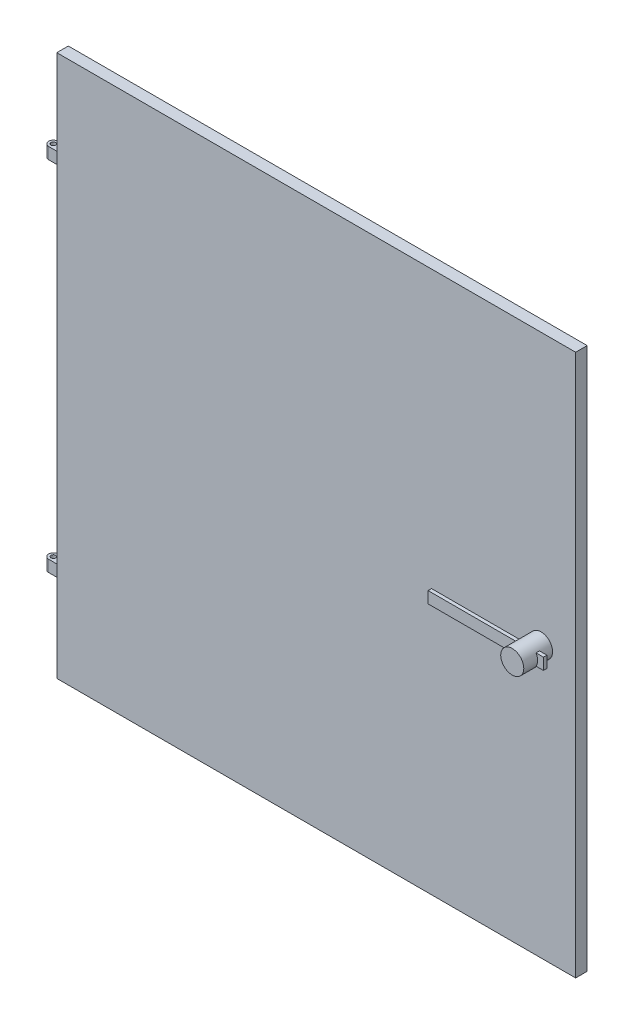
ISO-10303-21;
HEADER;
FILE_DESCRIPTION(('STEP AP214'),'2;1');
FILE_NAME('part.step','',(''),(''),'','','');
FILE_SCHEMA(('AUTOMOTIVE_DESIGN { 1 0 10303 214 1 1 1 1 }'));
ENDSEC;
DATA;
#1=APPLICATION_CONTEXT('core data for automotive mechanical design processes');
#2=APPLICATION_PROTOCOL_DEFINITION('international standard','automotive_design',2000,#1);
#3=PRODUCT_CONTEXT('',#1,'mechanical');
#4=PRODUCT('Part','Part','',(#3));
#5=PRODUCT_RELATED_PRODUCT_CATEGORY('part','',(#4));
#6=PRODUCT_DEFINITION_FORMATION('','',#4);
#7=PRODUCT_DEFINITION_CONTEXT('part definition',#1,'design');
#8=PRODUCT_DEFINITION('design','',#6,#7);
#9=PRODUCT_DEFINITION_SHAPE('','',#8);
#10=(LENGTH_UNIT() NAMED_UNIT(*) SI_UNIT(.MILLI.,.METRE.));
#11=(NAMED_UNIT(*) PLANE_ANGLE_UNIT() SI_UNIT($,.RADIAN.));
#12=(NAMED_UNIT(*) SI_UNIT($,.STERADIAN.) SOLID_ANGLE_UNIT());
#13=UNCERTAINTY_MEASURE_WITH_UNIT(LENGTH_MEASURE(1.E-05),#10,'distance_accuracy_value','');
#14=(GEOMETRIC_REPRESENTATION_CONTEXT(3) GLOBAL_UNCERTAINTY_ASSIGNED_CONTEXT((#13)) GLOBAL_UNIT_ASSIGNED_CONTEXT((#10,
#11,#12)) REPRESENTATION_CONTEXT('',''));
#15=CARTESIAN_POINT('',(0.,0.,0.));
#16=DIRECTION('',(0.,0.,1.));
#17=DIRECTION('',(1.,0.,0.));
#18=AXIS2_PLACEMENT_3D('',#15,#16,#17);
#19=CARTESIAN_POINT('',(420.,235.,35.));
#20=DIRECTION('',(0.,0.,-1.));
#21=DIRECTION('',(-1.,0.,0.));
#22=AXIS2_PLACEMENT_3D('',#19,#20,#21);
#23=CYLINDRICAL_SURFACE('',#22,9.99999999999998);
#24=CARTESIAN_POINT('',(420.,235.,23.));
#25=DIRECTION('',(0.,0.,-1.));
#26=DIRECTION('',(-1.,0.,0.));
#27=AXIS2_PLACEMENT_3D('',#24,#25,#26);
#28=CIRCLE('',#27,9.99999999999998);
#29=CARTESIAN_POINT('',(411.339745962156,230.,23.));
#30=VERTEX_POINT('',#29);
#31=CARTESIAN_POINT('',(411.339745962156,240.,23.));
#32=VERTEX_POINT('',#31);
#33=EDGE_CURVE('E49',#30,#32,#28,.T.);
#34=ORIENTED_EDGE('',*,*,#33,.F.);
#35=DIRECTION('',(0.,0.,-1.));
#36=VECTOR('',#35,1.);
#37=CARTESIAN_POINT('',(411.339745962156,230.,35.));
#38=LINE('',#37,#36);
#39=CARTESIAN_POINT('',(411.339745962156,230.,20.));
#40=VERTEX_POINT('',#39);
#41=EDGE_CURVE('E209',#40,#30,#38,.F.);
#42=ORIENTED_EDGE('',*,*,#41,.F.);
#43=CARTESIAN_POINT('',(420.,235.,20.));
#44=DIRECTION('',(0.,0.,-1.));
#45=DIRECTION('',(-1.,0.,0.));
#46=AXIS2_PLACEMENT_3D('',#43,#44,#45);
#47=CIRCLE('',#46,9.99999999999998);
#48=CARTESIAN_POINT('',(411.339745962156,240.,20.));
#49=VERTEX_POINT('',#48);
#50=EDGE_CURVE('E379',#40,#49,#47,.T.);
#51=ORIENTED_EDGE('',*,*,#50,.T.);
#52=DIRECTION('',(0.,0.,-1.));
#53=VECTOR('',#52,1.);
#54=CARTESIAN_POINT('',(411.339745962156,240.,35.));
#55=LINE('',#54,#53);
#56=EDGE_CURVE('E382',#32,#49,#55,.T.);
#57=ORIENTED_EDGE('',*,*,#56,.F.);
#58=EDGE_LOOP('',(#34,#42,#51,#57));
#59=FACE_BOUND('',#58,.T.);
#60=CARTESIAN_POINT('',(420.,235.,35.));
#61=DIRECTION('',(0.,0.,1.));
#62=DIRECTION('',(1.,0.,0.));
#63=AXIS2_PLACEMENT_3D('',#60,#61,#62);
#64=CIRCLE('',#63,9.99999999999998);
#65=CARTESIAN_POINT('',(430.,235.,35.));
#66=VERTEX_POINT('',#65);
#67=EDGE_CURVE('E227',#66,#66,#64,.T.);
#68=ORIENTED_EDGE('',*,*,#67,.F.);
#69=EDGE_LOOP('',(#68));
#70=FACE_BOUND('',#69,.T.);
#71=CARTESIAN_POINT('',(420.,235.,10.));
#72=DIRECTION('',(0.,0.,-1.));
#73=DIRECTION('',(-1.,0.,0.));
#74=AXIS2_PLACEMENT_3D('',#71,#72,#73);
#75=CIRCLE('',#74,9.99999999999998);
#76=CARTESIAN_POINT('',(410.,235.,10.));
#77=VERTEX_POINT('',#76);
#78=EDGE_CURVE('E376',#77,#77,#75,.F.);
#79=ORIENTED_EDGE('',*,*,#78,.T.);
#80=EDGE_LOOP('',(#79));
#81=FACE_BOUND('',#80,.T.);
#82=CARTESIAN_POINT('',(428.660254037844,240.,23.));
#83=VERTEX_POINT('',#82);
#84=CARTESIAN_POINT('',(428.660254037844,230.,23.));
#85=VERTEX_POINT('',#84);
#86=EDGE_CURVE('E11',#83,#85,#28,.T.);
#87=ORIENTED_EDGE('',*,*,#86,.F.);
#88=DIRECTION('',(0.,0.,-1.));
#89=VECTOR('',#88,1.);
#90=CARTESIAN_POINT('',(428.660254037844,240.,35.));
#91=LINE('',#90,#89);
#92=CARTESIAN_POINT('',(428.660254037844,240.,20.));
#93=VERTEX_POINT('',#92);
#94=EDGE_CURVE('E385',#93,#83,#91,.F.);
#95=ORIENTED_EDGE('',*,*,#94,.F.);
#96=CARTESIAN_POINT('',(428.660254037844,230.,20.));
#97=VERTEX_POINT('',#96);
#98=EDGE_CURVE('E383',#93,#97,#47,.T.);
#99=ORIENTED_EDGE('',*,*,#98,.T.);
#100=DIRECTION('',(0.,0.,-1.));
#101=VECTOR('',#100,1.);
#102=CARTESIAN_POINT('',(428.660254037844,230.,35.));
#103=LINE('',#102,#101);
#104=EDGE_CURVE('E43',#85,#97,#103,.T.);
#105=ORIENTED_EDGE('',*,*,#104,.F.);
#106=EDGE_LOOP('',(#87,#95,#99,#105));
#107=FACE_BOUND('',#106,.T.);
#108=ADVANCED_FACE('F39',(#59,#70,#81,#107),#23,.T.);
#109=CARTESIAN_POINT('',(0.,0.,10.));
#110=DIRECTION('',(1.,0.,0.));
#111=DIRECTION('',(0.,0.,-1.));
#112=AXIS2_PLACEMENT_3D('',#109,#110,#111);
#113=PLANE('',#112);
#114=DIRECTION('',(0.,0.,-1.));
#115=VECTOR('',#114,1.);
#116=CARTESIAN_POINT('',(0.,385.,9.));
#117=LINE('',#116,#115);
#118=CARTESIAN_POINT('',(0.,385.,9.));
#119=VERTEX_POINT('',#118);
#120=CARTESIAN_POINT('',(0.,385.,0.999999999999997));
#121=VERTEX_POINT('',#120);
#122=EDGE_CURVE('E291',#119,#121,#117,.T.);
#123=ORIENTED_EDGE('',*,*,#122,.T.);
#124=DIRECTION('',(0.,1.,0.));
#125=VECTOR('',#124,1.);
#126=CARTESIAN_POINT('',(0.,385.,0.999999999999997));
#127=LINE('',#126,#125);
#128=CARTESIAN_POINT('',(0.,395.,0.999999999999997));
#129=VERTEX_POINT('',#128);
#130=EDGE_CURVE('E309',#121,#129,#127,.T.);
#131=ORIENTED_EDGE('',*,*,#130,.T.);
#132=DIRECTION('',(0.,0.,-1.));
#133=VECTOR('',#132,1.);
#134=CARTESIAN_POINT('',(0.,395.,9.));
#135=LINE('',#134,#133);
#136=CARTESIAN_POINT('',(0.,395.,9.00000000000001));
#137=VERTEX_POINT('',#136);
#138=EDGE_CURVE('E302',#137,#129,#135,.T.);
#139=ORIENTED_EDGE('',*,*,#138,.F.);
#140=DIRECTION('',(0.,1.,0.));
#141=VECTOR('',#140,1.);
#142=CARTESIAN_POINT('',(0.,385.,9.));
#143=LINE('',#142,#141);
#144=EDGE_CURVE('E312',#119,#137,#143,.T.);
#145=ORIENTED_EDGE('',*,*,#144,.F.);
#146=EDGE_LOOP('',(#123,#131,#139,#145));
#147=FACE_BOUND('',#146,.T.);
#148=DIRECTION('',(0.,-1.,0.));
#149=VECTOR('',#148,1.);
#150=CARTESIAN_POINT('',(0.,0.,0.));
#151=LINE('',#150,#149);
#152=CARTESIAN_POINT('',(0.,470.,0.));
#153=VERTEX_POINT('',#152);
#154=CARTESIAN_POINT('',(0.,0.,0.));
#155=VERTEX_POINT('',#154);
#156=EDGE_CURVE('E319',#153,#155,#151,.T.);
#157=ORIENTED_EDGE('',*,*,#156,.T.);
#158=DIRECTION('',(0.,0.,-1.));
#159=VECTOR('',#158,1.);
#160=CARTESIAN_POINT('',(0.,0.,10.));
#161=LINE('',#160,#159);
#162=CARTESIAN_POINT('',(0.,0.,10.));
#163=VERTEX_POINT('',#162);
#164=EDGE_CURVE('E373',#163,#155,#161,.T.);
#165=ORIENTED_EDGE('',*,*,#164,.F.);
#166=DIRECTION('',(0.,-1.,0.));
#167=VECTOR('',#166,1.);
#168=CARTESIAN_POINT('',(0.,0.,10.));
#169=LINE('',#168,#167);
#170=CARTESIAN_POINT('',(0.,470.,10.));
#171=VERTEX_POINT('',#170);
#172=EDGE_CURVE('E347',#171,#163,#169,.T.);
#173=ORIENTED_EDGE('',*,*,#172,.F.);
#174=DIRECTION('',(0.,0.,-1.));
#175=VECTOR('',#174,1.);
#176=CARTESIAN_POINT('',(0.,470.,10.));
#177=LINE('',#176,#175);
#178=EDGE_CURVE('E357',#171,#153,#177,.T.);
#179=ORIENTED_EDGE('',*,*,#178,.T.);
#180=EDGE_LOOP('',(#157,#165,#173,#179));
#181=FACE_BOUND('',#180,.T.);
#182=DIRECTION('',(0.,-1.,0.));
#183=VECTOR('',#182,1.);
#184=CARTESIAN_POINT('',(0.,84.9999999999999,9.));
#185=LINE('',#184,#183);
#186=CARTESIAN_POINT('',(0.,84.9999999999999,9.00000000000001));
#187=VERTEX_POINT('',#186);
#188=CARTESIAN_POINT('',(0.,74.9999999999999,9.00000000000001));
#189=VERTEX_POINT('',#188);
#190=EDGE_CURVE('E270',#187,#189,#185,.T.);
#191=ORIENTED_EDGE('',*,*,#190,.T.);
#192=DIRECTION('',(0.,0.,-1.));
#193=VECTOR('',#192,1.);
#194=CARTESIAN_POINT('',(0.,74.9999999999999,9.));
#195=LINE('',#194,#193);
#196=CARTESIAN_POINT('',(0.,74.9999999999999,0.999999999999997));
#197=VERTEX_POINT('',#196);
#198=EDGE_CURVE('E262',#189,#197,#195,.T.);
#199=ORIENTED_EDGE('',*,*,#198,.T.);
#200=DIRECTION('',(0.,-1.,0.));
#201=VECTOR('',#200,1.);
#202=CARTESIAN_POINT('',(0.,84.9999999999999,0.999999999999997));
#203=LINE('',#202,#201);
#204=CARTESIAN_POINT('',(0.,84.9999999999999,0.999999999999997));
#205=VERTEX_POINT('',#204);
#206=EDGE_CURVE('E272',#205,#197,#203,.T.);
#207=ORIENTED_EDGE('',*,*,#206,.F.);
#208=DIRECTION('',(0.,0.,-1.));
#209=VECTOR('',#208,1.);
#210=CARTESIAN_POINT('',(0.,84.9999999999999,9.));
#211=LINE('',#210,#209);
#212=EDGE_CURVE('E251',#187,#205,#211,.T.);
#213=ORIENTED_EDGE('',*,*,#212,.F.);
#214=EDGE_LOOP('',(#191,#199,#207,#213));
#215=FACE_BOUND('',#214,.T.);
#216=ADVANCED_FACE('F41',(#147,#181,#215),#113,.F.);
#217=CARTESIAN_POINT('',(0.,470.,0.));
#218=DIRECTION('',(0.,0.,-1.));
#219=DIRECTION('',(-1.,0.,0.));
#220=AXIS2_PLACEMENT_3D('',#217,#218,#219);
#221=PLANE('',#220);
#222=ORIENTED_EDGE('',*,*,#156,.F.);
#223=DIRECTION('',(-1.,0.,0.));
#224=VECTOR('',#223,1.);
#225=CARTESIAN_POINT('',(0.,470.,0.));
#226=LINE('',#225,#224);
#227=CARTESIAN_POINT('',(450.,470.,0.));
#228=VERTEX_POINT('',#227);
#229=EDGE_CURVE('E351',#228,#153,#226,.T.);
#230=ORIENTED_EDGE('',*,*,#229,.F.);
#231=DIRECTION('',(0.,1.,0.));
#232=VECTOR('',#231,1.);
#233=CARTESIAN_POINT('',(450.,0.,0.));
#234=LINE('',#233,#232);
#235=CARTESIAN_POINT('',(450.,0.,0.));
#236=VERTEX_POINT('',#235);
#237=EDGE_CURVE('E362',#236,#228,#234,.T.);
#238=ORIENTED_EDGE('',*,*,#237,.F.);
#239=DIRECTION('',(1.,0.,0.));
#240=VECTOR('',#239,1.);
#241=CARTESIAN_POINT('',(0.,0.,0.));
#242=LINE('',#241,#240);
#243=EDGE_CURVE('E360',#155,#236,#242,.T.);
#244=ORIENTED_EDGE('',*,*,#243,.F.);
#245=EDGE_LOOP('',(#222,#230,#238,#244));
#246=FACE_BOUND('',#245,.T.);
#247=DIRECTION('',(-1.,0.,0.));
#248=VECTOR('',#247,1.);
#249=CARTESIAN_POINT('',(0.,468.,0.));
#250=LINE('',#249,#248);
#251=CARTESIAN_POINT('',(448.,468.,0.));
#252=VERTEX_POINT('',#251);
#253=CARTESIAN_POINT('',(2.,468.,0.));
#254=VERTEX_POINT('',#253);
#255=EDGE_CURVE('E325',#252,#254,#250,.T.);
#256=ORIENTED_EDGE('',*,*,#255,.T.);
#257=DIRECTION('',(0.,-1.,0.));
#258=VECTOR('',#257,1.);
#259=CARTESIAN_POINT('',(2.,470.,0.));
#260=LINE('',#259,#258);
#261=CARTESIAN_POINT('',(2.,2.,0.));
#262=VERTEX_POINT('',#261);
#263=EDGE_CURVE('E308',#254,#262,#260,.T.);
#264=ORIENTED_EDGE('',*,*,#263,.T.);
#265=DIRECTION('',(1.,0.,0.));
#266=VECTOR('',#265,1.);
#267=CARTESIAN_POINT('',(0.,2.,0.));
#268=LINE('',#267,#266);
#269=CARTESIAN_POINT('',(448.,2.,0.));
#270=VERTEX_POINT('',#269);
#271=EDGE_CURVE('E339',#262,#270,#268,.T.);
#272=ORIENTED_EDGE('',*,*,#271,.T.);
#273=DIRECTION('',(0.,1.,0.));
#274=VECTOR('',#273,1.);
#275=CARTESIAN_POINT('',(448.,470.,0.));
#276=LINE('',#275,#274);
#277=EDGE_CURVE('E342',#270,#252,#276,.T.);
#278=ORIENTED_EDGE('',*,*,#277,.T.);
#279=EDGE_LOOP('',(#256,#264,#272,#278));
#280=FACE_BOUND('',#279,.T.);
#281=ADVANCED_FACE('F437',(#246,#280),#221,.T.);
#282=CARTESIAN_POINT('',(0.,0.,10.));
#283=DIRECTION('',(0.,1.,0.));
#284=DIRECTION('',(0.,0.,1.));
#285=AXIS2_PLACEMENT_3D('',#282,#283,#284);
#286=PLANE('',#285);
#287=ORIENTED_EDGE('',*,*,#243,.T.);
#288=DIRECTION('',(0.,0.,-1.));
#289=VECTOR('',#288,1.);
#290=CARTESIAN_POINT('',(450.,0.,10.));
#291=LINE('',#290,#289);
#292=CARTESIAN_POINT('',(450.,0.,10.));
#293=VERTEX_POINT('',#292);
#294=EDGE_CURVE('E370',#293,#236,#291,.T.);
#295=ORIENTED_EDGE('',*,*,#294,.F.);
#296=DIRECTION('',(1.,0.,0.));
#297=VECTOR('',#296,1.);
#298=CARTESIAN_POINT('',(0.,0.,10.));
#299=LINE('',#298,#297);
#300=EDGE_CURVE('E350',#163,#293,#299,.T.);
#301=ORIENTED_EDGE('',*,*,#300,.F.);
#302=ORIENTED_EDGE('',*,*,#164,.T.);
#303=EDGE_LOOP('',(#287,#295,#301,#302));
#304=FACE_BOUND('',#303,.T.);
#305=ADVANCED_FACE('F519',(#304),#286,.F.);
#306=CARTESIAN_POINT('',(450.,0.,10.));
#307=DIRECTION('',(-1.,0.,0.));
#308=DIRECTION('',(0.,0.,1.));
#309=AXIS2_PLACEMENT_3D('',#306,#307,#308);
#310=PLANE('',#309);
#311=ORIENTED_EDGE('',*,*,#237,.T.);
#312=DIRECTION('',(0.,0.,-1.));
#313=VECTOR('',#312,1.);
#314=CARTESIAN_POINT('',(450.,470.,10.));
#315=LINE('',#314,#313);
#316=CARTESIAN_POINT('',(450.,470.,10.));
#317=VERTEX_POINT('',#316);
#318=EDGE_CURVE('E367',#317,#228,#315,.T.);
#319=ORIENTED_EDGE('',*,*,#318,.F.);
#320=DIRECTION('',(0.,1.,0.));
#321=VECTOR('',#320,1.);
#322=CARTESIAN_POINT('',(450.,0.,10.));
#323=LINE('',#322,#321);
#324=EDGE_CURVE('E353',#293,#317,#323,.T.);
#325=ORIENTED_EDGE('',*,*,#324,.F.);
#326=ORIENTED_EDGE('',*,*,#294,.T.);
#327=EDGE_LOOP('',(#311,#319,#325,#326));
#328=FACE_BOUND('',#327,.T.);
#329=ADVANCED_FACE('F523',(#328),#310,.F.);
#330=CARTESIAN_POINT('',(0.,470.,10.));
#331=DIRECTION('',(0.,-1.,0.));
#332=DIRECTION('',(0.,0.,-1.));
#333=AXIS2_PLACEMENT_3D('',#330,#331,#332);
#334=PLANE('',#333);
#335=ORIENTED_EDGE('',*,*,#229,.T.);
#336=ORIENTED_EDGE('',*,*,#178,.F.);
#337=DIRECTION('',(-1.,0.,0.));
#338=VECTOR('',#337,1.);
#339=CARTESIAN_POINT('',(0.,470.,10.));
#340=LINE('',#339,#338);
#341=EDGE_CURVE('E355',#317,#171,#340,.T.);
#342=ORIENTED_EDGE('',*,*,#341,.F.);
#343=ORIENTED_EDGE('',*,*,#318,.T.);
#344=EDGE_LOOP('',(#335,#336,#342,#343));
#345=FACE_BOUND('',#344,.T.);
#346=ADVANCED_FACE('F515',(#345),#334,.F.);
#347=CARTESIAN_POINT('',(0.,470.,10.));
#348=DIRECTION('',(0.,0.,-1.));
#349=DIRECTION('',(-1.,0.,0.));
#350=AXIS2_PLACEMENT_3D('',#347,#348,#349);
#351=PLANE('',#350);
#352=ORIENTED_EDGE('',*,*,#78,.F.);
#353=EDGE_LOOP('',(#352));
#354=FACE_BOUND('',#353,.T.);
#355=ORIENTED_EDGE('',*,*,#172,.T.);
#356=ORIENTED_EDGE('',*,*,#300,.T.);
#357=ORIENTED_EDGE('',*,*,#324,.T.);
#358=ORIENTED_EDGE('',*,*,#341,.T.);
#359=EDGE_LOOP('',(#355,#356,#357,#358));
#360=FACE_BOUND('',#359,.T.);
#361=ADVANCED_FACE('F497',(#354,#360),#351,.F.);
#362=CARTESIAN_POINT('',(2.,0.,10.));
#363=DIRECTION('',(1.,0.,0.));
#364=DIRECTION('',(0.,0.,-1.));
#365=AXIS2_PLACEMENT_3D('',#362,#363,#364);
#366=PLANE('',#365);
#367=ORIENTED_EDGE('',*,*,#263,.F.);
#368=DIRECTION('',(0.,0.,-1.));
#369=VECTOR('',#368,1.);
#370=CARTESIAN_POINT('',(2.,468.,10.));
#371=LINE('',#370,#369);
#372=CARTESIAN_POINT('',(2.,468.,8.));
#373=VERTEX_POINT('',#372);
#374=EDGE_CURVE('E326',#373,#254,#371,.T.);
#375=ORIENTED_EDGE('',*,*,#374,.F.);
#376=DIRECTION('',(0.,-1.,0.));
#377=VECTOR('',#376,1.);
#378=CARTESIAN_POINT('',(2.,470.,8.));
#379=LINE('',#378,#377);
#380=CARTESIAN_POINT('',(2.,2.,8.));
#381=VERTEX_POINT('',#380);
#382=EDGE_CURVE('E321',#373,#381,#379,.T.);
#383=ORIENTED_EDGE('',*,*,#382,.T.);
#384=DIRECTION('',(0.,0.,-1.));
#385=VECTOR('',#384,1.);
#386=CARTESIAN_POINT('',(2.,2.,10.));
#387=LINE('',#386,#385);
#388=EDGE_CURVE('E316',#381,#262,#387,.T.);
#389=ORIENTED_EDGE('',*,*,#388,.T.);
#390=EDGE_LOOP('',(#367,#375,#383,#389));
#391=FACE_BOUND('',#390,.T.);
#392=ADVANCED_FACE('F493',(#391),#366,.T.);
#393=CARTESIAN_POINT('',(0.,2.,10.));
#394=DIRECTION('',(0.,1.,0.));
#395=DIRECTION('',(0.,0.,1.));
#396=AXIS2_PLACEMENT_3D('',#393,#394,#395);
#397=PLANE('',#396);
#398=ORIENTED_EDGE('',*,*,#271,.F.);
#399=ORIENTED_EDGE('',*,*,#388,.F.);
#400=DIRECTION('',(1.,0.,0.));
#401=VECTOR('',#400,1.);
#402=CARTESIAN_POINT('',(0.,2.,8.));
#403=LINE('',#402,#401);
#404=CARTESIAN_POINT('',(448.,2.,8.));
#405=VERTEX_POINT('',#404);
#406=EDGE_CURVE('E324',#381,#405,#403,.T.);
#407=ORIENTED_EDGE('',*,*,#406,.T.);
#408=DIRECTION('',(0.,0.,-1.));
#409=VECTOR('',#408,1.);
#410=CARTESIAN_POINT('',(448.,2.,10.));
#411=LINE('',#410,#409);
#412=EDGE_CURVE('E320',#405,#270,#411,.T.);
#413=ORIENTED_EDGE('',*,*,#412,.T.);
#414=EDGE_LOOP('',(#398,#399,#407,#413));
#415=FACE_BOUND('',#414,.T.);
#416=ADVANCED_FACE('F496',(#415),#397,.T.);
#417=CARTESIAN_POINT('',(448.,0.,10.));
#418=DIRECTION('',(-1.,0.,0.));
#419=DIRECTION('',(0.,0.,1.));
#420=AXIS2_PLACEMENT_3D('',#417,#418,#419);
#421=PLANE('',#420);
#422=ORIENTED_EDGE('',*,*,#277,.F.);
#423=ORIENTED_EDGE('',*,*,#412,.F.);
#424=DIRECTION('',(0.,1.,0.));
#425=VECTOR('',#424,1.);
#426=CARTESIAN_POINT('',(448.,470.,8.));
#427=LINE('',#426,#425);
#428=CARTESIAN_POINT('',(448.,468.,8.));
#429=VERTEX_POINT('',#428);
#430=EDGE_CURVE('E333',#405,#429,#427,.T.);
#431=ORIENTED_EDGE('',*,*,#430,.T.);
#432=DIRECTION('',(0.,0.,-1.));
#433=VECTOR('',#432,1.);
#434=CARTESIAN_POINT('',(448.,468.,10.));
#435=LINE('',#434,#433);
#436=EDGE_CURVE('E328',#429,#252,#435,.T.);
#437=ORIENTED_EDGE('',*,*,#436,.T.);
#438=EDGE_LOOP('',(#422,#423,#431,#437));
#439=FACE_BOUND('',#438,.T.);
#440=ADVANCED_FACE('F501',(#439),#421,.T.);
#441=CARTESIAN_POINT('',(0.,468.,10.));
#442=DIRECTION('',(0.,-1.,0.));
#443=DIRECTION('',(0.,0.,-1.));
#444=AXIS2_PLACEMENT_3D('',#441,#442,#443);
#445=PLANE('',#444);
#446=ORIENTED_EDGE('',*,*,#255,.F.);
#447=ORIENTED_EDGE('',*,*,#436,.F.);
#448=DIRECTION('',(-1.,0.,0.));
#449=VECTOR('',#448,1.);
#450=CARTESIAN_POINT('',(0.,468.,8.));
#451=LINE('',#450,#449);
#452=EDGE_CURVE('E329',#429,#373,#451,.T.);
#453=ORIENTED_EDGE('',*,*,#452,.T.);
#454=ORIENTED_EDGE('',*,*,#374,.T.);
#455=EDGE_LOOP('',(#446,#447,#453,#454));
#456=FACE_BOUND('',#455,.T.);
#457=ADVANCED_FACE('F505',(#456),#445,.T.);
#458=CARTESIAN_POINT('',(0.,470.,8.));
#459=DIRECTION('',(0.,0.,-1.));
#460=DIRECTION('',(-1.,0.,0.));
#461=AXIS2_PLACEMENT_3D('',#458,#459,#460);
#462=PLANE('',#461);
#463=ORIENTED_EDGE('',*,*,#382,.F.);
#464=ORIENTED_EDGE('',*,*,#452,.F.);
#465=ORIENTED_EDGE('',*,*,#430,.F.);
#466=ORIENTED_EDGE('',*,*,#406,.F.);
#467=EDGE_LOOP('',(#463,#464,#465,#466));
#468=FACE_BOUND('',#467,.T.);
#469=ADVANCED_FACE('F491',(#468),#462,.T.);
#470=CARTESIAN_POINT('',(-8.,385.,5.));
#471=DIRECTION('',(0.,1.,0.));
#472=DIRECTION('',(0.,0.,1.));
#473=AXIS2_PLACEMENT_3D('',#470,#471,#472);
#474=CYLINDRICAL_SURFACE('',#473,4.);
#475=CARTESIAN_POINT('',(-8.,395.,5.));
#476=DIRECTION('',(0.,1.,0.));
#477=DIRECTION('',(0.,0.,1.));
#478=AXIS2_PLACEMENT_3D('',#475,#476,#477);
#479=CIRCLE('',#478,4.);
#480=CARTESIAN_POINT('',(-8.,395.,0.999999999999999));
#481=VERTEX_POINT('',#480);
#482=CARTESIAN_POINT('',(-8.,395.,9.00000000000001));
#483=VERTEX_POINT('',#482);
#484=EDGE_CURVE('E281',#481,#483,#479,.T.);
#485=ORIENTED_EDGE('',*,*,#484,.F.);
#486=DIRECTION('',(0.,1.,0.));
#487=VECTOR('',#486,1.);
#488=CARTESIAN_POINT('',(-8.,385.,0.999999999999999));
#489=LINE('',#488,#487);
#490=CARTESIAN_POINT('',(-8.,385.,0.999999999999999));
#491=VERTEX_POINT('',#490);
#492=EDGE_CURVE('E306',#491,#481,#489,.T.);
#493=ORIENTED_EDGE('',*,*,#492,.F.);
#494=CARTESIAN_POINT('',(-8.,385.,5.));
#495=DIRECTION('',(0.,1.,0.));
#496=DIRECTION('',(0.,0.,1.));
#497=AXIS2_PLACEMENT_3D('',#494,#495,#496);
#498=CIRCLE('',#497,4.);
#499=CARTESIAN_POINT('',(-8.,385.,9.00000000000001));
#500=VERTEX_POINT('',#499);
#501=EDGE_CURVE('E284',#491,#500,#498,.T.);
#502=ORIENTED_EDGE('',*,*,#501,.T.);
#503=DIRECTION('',(0.,1.,0.));
#504=VECTOR('',#503,1.);
#505=CARTESIAN_POINT('',(-8.,385.,9.00000000000001));
#506=LINE('',#505,#504);
#507=EDGE_CURVE('E297',#500,#483,#506,.T.);
#508=ORIENTED_EDGE('',*,*,#507,.T.);
#509=EDGE_LOOP('',(#485,#493,#502,#508));
#510=FACE_BOUND('',#509,.T.);
#511=ADVANCED_FACE('F484',(#510),#474,.T.);
#512=CARTESIAN_POINT('',(0.,385.,0.999999999999997));
#513=DIRECTION('',(0.,0.,-1.));
#514=DIRECTION('',(-1.,0.,0.));
#515=AXIS2_PLACEMENT_3D('',#512,#513,#514);
#516=PLANE('',#515);
#517=DIRECTION('',(-1.,0.,0.));
#518=VECTOR('',#517,1.);
#519=CARTESIAN_POINT('',(0.,395.,0.999999999999997));
#520=LINE('',#519,#518);
#521=EDGE_CURVE('E288',#129,#481,#520,.T.);
#522=ORIENTED_EDGE('',*,*,#521,.F.);
#523=ORIENTED_EDGE('',*,*,#130,.F.);
#524=DIRECTION('',(-1.,0.,0.));
#525=VECTOR('',#524,1.);
#526=CARTESIAN_POINT('',(0.,385.,0.999999999999997));
#527=LINE('',#526,#525);
#528=EDGE_CURVE('E294',#121,#491,#527,.T.);
#529=ORIENTED_EDGE('',*,*,#528,.T.);
#530=ORIENTED_EDGE('',*,*,#492,.T.);
#531=EDGE_LOOP('',(#522,#523,#529,#530));
#532=FACE_BOUND('',#531,.T.);
#533=ADVANCED_FACE('F481',(#532),#516,.T.);
#534=CARTESIAN_POINT('',(-8.,385.,9.00000000000001));
#535=DIRECTION('',(0.,0.,1.));
#536=DIRECTION('',(1.,0.,0.));
#537=AXIS2_PLACEMENT_3D('',#534,#535,#536);
#538=PLANE('',#537);
#539=DIRECTION('',(1.,0.,0.));
#540=VECTOR('',#539,1.);
#541=CARTESIAN_POINT('',(-8.,395.,9.00000000000001));
#542=LINE('',#541,#540);
#543=EDGE_CURVE('E300',#483,#137,#542,.T.);
#544=ORIENTED_EDGE('',*,*,#543,.F.);
#545=ORIENTED_EDGE('',*,*,#507,.F.);
#546=DIRECTION('',(1.,0.,0.));
#547=VECTOR('',#546,1.);
#548=CARTESIAN_POINT('',(-8.,385.,9.00000000000001));
#549=LINE('',#548,#547);
#550=EDGE_CURVE('E287',#500,#119,#549,.T.);
#551=ORIENTED_EDGE('',*,*,#550,.T.);
#552=ORIENTED_EDGE('',*,*,#144,.T.);
#553=EDGE_LOOP('',(#544,#545,#551,#552));
#554=FACE_BOUND('',#553,.T.);
#555=ADVANCED_FACE('F476',(#554),#538,.T.);
#556=CARTESIAN_POINT('',(-8.,385.,5.));
#557=DIRECTION('',(0.,1.,0.));
#558=DIRECTION('',(0.,0.,1.));
#559=AXIS2_PLACEMENT_3D('',#556,#557,#558);
#560=PLANE('',#559);
#561=CARTESIAN_POINT('',(-8.,385.,5.));
#562=DIRECTION('',(0.,1.,0.));
#563=DIRECTION('',(0.,0.,1.));
#564=AXIS2_PLACEMENT_3D('',#561,#562,#563);
#565=CIRCLE('',#564,2.);
#566=CARTESIAN_POINT('',(-8.,385.,7.));
#567=VERTEX_POINT('',#566);
#568=EDGE_CURVE('E277',#567,#567,#565,.T.);
#569=ORIENTED_EDGE('',*,*,#568,.T.);
#570=EDGE_LOOP('',(#569));
#571=FACE_BOUND('',#570,.T.);
#572=ORIENTED_EDGE('',*,*,#501,.F.);
#573=ORIENTED_EDGE('',*,*,#528,.F.);
#574=ORIENTED_EDGE('',*,*,#122,.F.);
#575=ORIENTED_EDGE('',*,*,#550,.F.);
#576=EDGE_LOOP('',(#572,#573,#574,#575));
#577=FACE_BOUND('',#576,.T.);
#578=ADVANCED_FACE('F473',(#571,#577),#560,.F.);
#579=CARTESIAN_POINT('',(-8.,395.,5.));
#580=DIRECTION('',(0.,1.,0.));
#581=DIRECTION('',(0.,0.,1.));
#582=AXIS2_PLACEMENT_3D('',#579,#580,#581);
#583=PLANE('',#582);
#584=CARTESIAN_POINT('',(-8.,395.,5.));
#585=DIRECTION('',(0.,1.,0.));
#586=DIRECTION('',(0.,0.,1.));
#587=AXIS2_PLACEMENT_3D('',#584,#585,#586);
#588=CIRCLE('',#587,2.);
#589=CARTESIAN_POINT('',(-8.,395.,7.));
#590=VERTEX_POINT('',#589);
#591=EDGE_CURVE('E269',#590,#590,#588,.T.);
#592=ORIENTED_EDGE('',*,*,#591,.F.);
#593=EDGE_LOOP('',(#592));
#594=FACE_BOUND('',#593,.T.);
#595=ORIENTED_EDGE('',*,*,#484,.T.);
#596=ORIENTED_EDGE('',*,*,#543,.T.);
#597=ORIENTED_EDGE('',*,*,#138,.T.);
#598=ORIENTED_EDGE('',*,*,#521,.T.);
#599=EDGE_LOOP('',(#595,#596,#597,#598));
#600=FACE_BOUND('',#599,.T.);
#601=ADVANCED_FACE('F471',(#594,#600),#583,.T.);
#602=CARTESIAN_POINT('',(-8.,385.,5.));
#603=DIRECTION('',(0.,1.,0.));
#604=DIRECTION('',(0.,0.,1.));
#605=AXIS2_PLACEMENT_3D('',#602,#603,#604);
#606=CYLINDRICAL_SURFACE('',#605,2.);
#607=ORIENTED_EDGE('',*,*,#568,.F.);
#608=EDGE_LOOP('',(#607));
#609=FACE_BOUND('',#608,.T.);
#610=ORIENTED_EDGE('',*,*,#591,.T.);
#611=EDGE_LOOP('',(#610));
#612=FACE_BOUND('',#611,.T.);
#613=ADVANCED_FACE('F453',(#609,#612),#606,.F.);
#614=CARTESIAN_POINT('',(-8.,84.9999999999999,5.));
#615=DIRECTION('',(0.,-1.,0.));
#616=DIRECTION('',(0.,0.,1.));
#617=AXIS2_PLACEMENT_3D('',#614,#615,#616);
#618=PLANE('',#617);
#619=CARTESIAN_POINT('',(-8.,84.9999999999999,5.));
#620=DIRECTION('',(0.,1.,0.));
#621=DIRECTION('',(0.,0.,1.));
#622=AXIS2_PLACEMENT_3D('',#619,#620,#621);
#623=CIRCLE('',#622,4.);
#624=CARTESIAN_POINT('',(-8.,84.9999999999999,0.999999999999999));
#625=VERTEX_POINT('',#624);
#626=CARTESIAN_POINT('',(-8.,84.9999999999999,9.00000000000001));
#627=VERTEX_POINT('',#626);
#628=EDGE_CURVE('E245',#625,#627,#623,.T.);
#629=ORIENTED_EDGE('',*,*,#628,.T.);
#630=DIRECTION('',(1.,0.,0.));
#631=VECTOR('',#630,1.);
#632=CARTESIAN_POINT('',(-8.,84.9999999999999,9.00000000000001));
#633=LINE('',#632,#631);
#634=EDGE_CURVE('E254',#627,#187,#633,.T.);
#635=ORIENTED_EDGE('',*,*,#634,.T.);
#636=ORIENTED_EDGE('',*,*,#212,.T.);
#637=DIRECTION('',(-1.,0.,0.));
#638=VECTOR('',#637,1.);
#639=CARTESIAN_POINT('',(0.,84.9999999999999,0.999999999999997));
#640=LINE('',#639,#638);
#641=EDGE_CURVE('E248',#205,#625,#640,.T.);
#642=ORIENTED_EDGE('',*,*,#641,.T.);
#643=EDGE_LOOP('',(#629,#635,#636,#642));
#644=FACE_BOUND('',#643,.T.);
#645=CARTESIAN_POINT('',(-8.,84.9999999999999,5.));
#646=DIRECTION('',(0.,1.,0.));
#647=DIRECTION('',(0.,0.,1.));
#648=AXIS2_PLACEMENT_3D('',#645,#646,#647);
#649=CIRCLE('',#648,2.);
#650=CARTESIAN_POINT('',(-8.,84.9999999999999,7.));
#651=VERTEX_POINT('',#650);
#652=EDGE_CURVE('E238',#651,#651,#649,.T.);
#653=ORIENTED_EDGE('',*,*,#652,.F.);
#654=EDGE_LOOP('',(#653));
#655=FACE_BOUND('',#654,.T.);
#656=ADVANCED_FACE('F449',(#644,#655),#618,.F.);
#657=CARTESIAN_POINT('',(-8.,74.9999999999999,5.));
#658=DIRECTION('',(0.,-1.,0.));
#659=DIRECTION('',(0.,0.,1.));
#660=AXIS2_PLACEMENT_3D('',#657,#658,#659);
#661=PLANE('',#660);
#662=CARTESIAN_POINT('',(-8.,74.9999999999999,5.));
#663=DIRECTION('',(0.,1.,0.));
#664=DIRECTION('',(0.,0.,1.));
#665=AXIS2_PLACEMENT_3D('',#662,#663,#664);
#666=CIRCLE('',#665,4.);
#667=CARTESIAN_POINT('',(-8.,74.9999999999999,0.999999999999999));
#668=VERTEX_POINT('',#667);
#669=CARTESIAN_POINT('',(-8.,74.9999999999999,9.00000000000001));
#670=VERTEX_POINT('',#669);
#671=EDGE_CURVE('E242',#668,#670,#666,.T.);
#672=ORIENTED_EDGE('',*,*,#671,.F.);
#673=DIRECTION('',(-1.,0.,0.));
#674=VECTOR('',#673,1.);
#675=CARTESIAN_POINT('',(0.,74.9999999999999,0.999999999999997));
#676=LINE('',#675,#674);
#677=EDGE_CURVE('E260',#197,#668,#676,.T.);
#678=ORIENTED_EDGE('',*,*,#677,.F.);
#679=ORIENTED_EDGE('',*,*,#198,.F.);
#680=DIRECTION('',(1.,0.,0.));
#681=VECTOR('',#680,1.);
#682=CARTESIAN_POINT('',(-8.,74.9999999999999,9.00000000000001));
#683=LINE('',#682,#681);
#684=EDGE_CURVE('E249',#670,#189,#683,.T.);
#685=ORIENTED_EDGE('',*,*,#684,.F.);
#686=EDGE_LOOP('',(#672,#678,#679,#685));
#687=FACE_BOUND('',#686,.T.);
#688=CARTESIAN_POINT('',(-8.,74.9999999999999,5.));
#689=DIRECTION('',(0.,1.,0.));
#690=DIRECTION('',(0.,0.,1.));
#691=AXIS2_PLACEMENT_3D('',#688,#689,#690);
#692=CIRCLE('',#691,2.);
#693=CARTESIAN_POINT('',(-8.,74.9999999999999,7.));
#694=VERTEX_POINT('',#693);
#695=EDGE_CURVE('E231',#694,#694,#692,.T.);
#696=ORIENTED_EDGE('',*,*,#695,.T.);
#697=EDGE_LOOP('',(#696));
#698=FACE_BOUND('',#697,.T.);
#699=ADVANCED_FACE('F452',(#687,#698),#661,.T.);
#700=CARTESIAN_POINT('',(-8.,84.9999999999999,5.));
#701=DIRECTION('',(0.,-1.,0.));
#702=DIRECTION('',(0.,0.,-1.));
#703=AXIS2_PLACEMENT_3D('',#700,#701,#702);
#704=CYLINDRICAL_SURFACE('',#703,4.);
#705=ORIENTED_EDGE('',*,*,#671,.T.);
#706=DIRECTION('',(0.,-1.,0.));
#707=VECTOR('',#706,1.);
#708=CARTESIAN_POINT('',(-8.,84.9999999999999,9.00000000000001));
#709=LINE('',#708,#707);
#710=EDGE_CURVE('E266',#627,#670,#709,.T.);
#711=ORIENTED_EDGE('',*,*,#710,.F.);
#712=ORIENTED_EDGE('',*,*,#628,.F.);
#713=DIRECTION('',(0.,-1.,0.));
#714=VECTOR('',#713,1.);
#715=CARTESIAN_POINT('',(-8.,84.9999999999999,0.999999999999999));
#716=LINE('',#715,#714);
#717=EDGE_CURVE('E257',#625,#668,#716,.T.);
#718=ORIENTED_EDGE('',*,*,#717,.T.);
#719=EDGE_LOOP('',(#705,#711,#712,#718));
#720=FACE_BOUND('',#719,.T.);
#721=ADVANCED_FACE('F457',(#720),#704,.T.);
#722=CARTESIAN_POINT('',(-8.,84.9999999999999,9.00000000000001));
#723=DIRECTION('',(0.,0.,-1.));
#724=DIRECTION('',(-1.,0.,0.));
#725=AXIS2_PLACEMENT_3D('',#722,#723,#724);
#726=PLANE('',#725);
#727=ORIENTED_EDGE('',*,*,#684,.T.);
#728=ORIENTED_EDGE('',*,*,#190,.F.);
#729=ORIENTED_EDGE('',*,*,#634,.F.);
#730=ORIENTED_EDGE('',*,*,#710,.T.);
#731=EDGE_LOOP('',(#727,#728,#729,#730));
#732=FACE_BOUND('',#731,.T.);
#733=ADVANCED_FACE('F459',(#732),#726,.F.);
#734=CARTESIAN_POINT('',(0.,84.9999999999999,0.999999999999997));
#735=DIRECTION('',(0.,0.,1.));
#736=DIRECTION('',(1.,0.,0.));
#737=AXIS2_PLACEMENT_3D('',#734,#735,#736);
#738=PLANE('',#737);
#739=ORIENTED_EDGE('',*,*,#677,.T.);
#740=ORIENTED_EDGE('',*,*,#717,.F.);
#741=ORIENTED_EDGE('',*,*,#641,.F.);
#742=ORIENTED_EDGE('',*,*,#206,.T.);
#743=EDGE_LOOP('',(#739,#740,#741,#742));
#744=FACE_BOUND('',#743,.T.);
#745=ADVANCED_FACE('F447',(#744),#738,.F.);
#746=CARTESIAN_POINT('',(-8.,84.9999999999999,5.));
#747=DIRECTION('',(0.,-1.,0.));
#748=DIRECTION('',(0.,0.,-1.));
#749=AXIS2_PLACEMENT_3D('',#746,#747,#748);
#750=CYLINDRICAL_SURFACE('',#749,2.);
#751=ORIENTED_EDGE('',*,*,#652,.T.);
#752=EDGE_LOOP('',(#751));
#753=FACE_BOUND('',#752,.T.);
#754=ORIENTED_EDGE('',*,*,#695,.F.);
#755=EDGE_LOOP('',(#754));
#756=FACE_BOUND('',#755,.T.);
#757=ADVANCED_FACE('F444',(#753,#756),#750,.F.);
#758=CARTESIAN_POINT('',(420.,235.,35.));
#759=DIRECTION('',(0.,0.,1.));
#760=DIRECTION('',(1.,0.,0.));
#761=AXIS2_PLACEMENT_3D('',#758,#759,#760);
#762=PLANE('',#761);
#763=ORIENTED_EDGE('',*,*,#67,.T.);
#764=EDGE_LOOP('',(#763));
#765=FACE_BOUND('',#764,.T.);
#766=ADVANCED_FACE('F442',(#765),#762,.T.);
#767=CARTESIAN_POINT('',(335.,230.,23.));
#768=DIRECTION('',(1.,0.,0.));
#769=DIRECTION('',(0.,0.,-1.));
#770=AXIS2_PLACEMENT_3D('',#767,#768,#769);
#771=PLANE('',#770);
#772=DIRECTION('',(0.,-1.,0.));
#773=VECTOR('',#772,1.);
#774=CARTESIAN_POINT('',(335.,230.,20.));
#775=LINE('',#774,#773);
#776=CARTESIAN_POINT('',(335.,240.,20.));
#777=VERTEX_POINT('',#776);
#778=CARTESIAN_POINT('',(335.,230.,20.));
#779=VERTEX_POINT('',#778);
#780=EDGE_CURVE('E226',#777,#779,#775,.T.);
#781=ORIENTED_EDGE('',*,*,#780,.T.);
#782=DIRECTION('',(0.,0.,-1.));
#783=VECTOR('',#782,1.);
#784=CARTESIAN_POINT('',(335.,230.,23.));
#785=LINE('',#784,#783);
#786=CARTESIAN_POINT('',(335.,230.,23.));
#787=VERTEX_POINT('',#786);
#788=EDGE_CURVE('E206',#787,#779,#785,.T.);
#789=ORIENTED_EDGE('',*,*,#788,.F.);
#790=DIRECTION('',(0.,-1.,0.));
#791=VECTOR('',#790,1.);
#792=CARTESIAN_POINT('',(335.,230.,23.));
#793=LINE('',#792,#791);
#794=CARTESIAN_POINT('',(335.,240.,23.));
#795=VERTEX_POINT('',#794);
#796=EDGE_CURVE('E216',#795,#787,#793,.T.);
#797=ORIENTED_EDGE('',*,*,#796,.F.);
#798=DIRECTION('',(0.,0.,-1.));
#799=VECTOR('',#798,1.);
#800=CARTESIAN_POINT('',(335.,240.,23.));
#801=LINE('',#800,#799);
#802=EDGE_CURVE('E405',#795,#777,#801,.T.);
#803=ORIENTED_EDGE('',*,*,#802,.T.);
#804=EDGE_LOOP('',(#781,#789,#797,#803));
#805=FACE_BOUND('',#804,.T.);
#806=ADVANCED_FACE('F225',(#805),#771,.F.);
#807=CARTESIAN_POINT('',(335.,230.,20.));
#808=DIRECTION('',(0.,0.,-1.));
#809=DIRECTION('',(-1.,0.,0.));
#810=AXIS2_PLACEMENT_3D('',#807,#808,#809);
#811=PLANE('',#810);
#812=ORIENTED_EDGE('',*,*,#50,.F.);
#813=DIRECTION('',(1.,0.,0.));
#814=VECTOR('',#813,1.);
#815=CARTESIAN_POINT('',(335.,230.,20.));
#816=LINE('',#815,#814);
#817=EDGE_CURVE('E411',#779,#40,#816,.T.);
#818=ORIENTED_EDGE('',*,*,#817,.F.);
#819=ORIENTED_EDGE('',*,*,#780,.F.);
#820=DIRECTION('',(-1.,0.,0.));
#821=VECTOR('',#820,1.);
#822=CARTESIAN_POINT('',(335.,240.,20.));
#823=LINE('',#822,#821);
#824=EDGE_CURVE('E64',#49,#777,#823,.T.);
#825=ORIENTED_EDGE('',*,*,#824,.F.);
#826=EDGE_LOOP('',(#812,#818,#819,#825));
#827=FACE_BOUND('',#826,.T.);
#828=ADVANCED_FACE('F427',(#827),#811,.T.);
#829=CARTESIAN_POINT('',(335.,230.,23.));
#830=DIRECTION('',(0.,0.,-1.));
#831=DIRECTION('',(-1.,0.,0.));
#832=AXIS2_PLACEMENT_3D('',#829,#830,#831);
#833=PLANE('',#832);
#834=DIRECTION('',(1.,0.,0.));
#835=VECTOR('',#834,1.);
#836=CARTESIAN_POINT('',(335.,230.,23.));
#837=LINE('',#836,#835);
#838=EDGE_CURVE('E201',#787,#30,#837,.T.);
#839=ORIENTED_EDGE('',*,*,#838,.T.);
#840=ORIENTED_EDGE('',*,*,#33,.T.);
#841=DIRECTION('',(-1.,0.,0.));
#842=VECTOR('',#841,1.);
#843=CARTESIAN_POINT('',(335.,240.,23.));
#844=LINE('',#843,#842);
#845=EDGE_CURVE('E219',#32,#795,#844,.T.);
#846=ORIENTED_EDGE('',*,*,#845,.T.);
#847=ORIENTED_EDGE('',*,*,#796,.T.);
#848=EDGE_LOOP('',(#839,#840,#846,#847));
#849=FACE_BOUND('',#848,.T.);
#850=ADVANCED_FACE('F217',(#849),#833,.F.);
#851=CARTESIAN_POINT('',(335.,240.,23.));
#852=DIRECTION('',(0.,-1.,0.));
#853=DIRECTION('',(1.,0.,0.));
#854=AXIS2_PLACEMENT_3D('',#851,#852,#853);
#855=PLANE('',#854);
#856=ORIENTED_EDGE('',*,*,#845,.F.);
#857=ORIENTED_EDGE('',*,*,#56,.T.);
#858=ORIENTED_EDGE('',*,*,#824,.T.);
#859=ORIENTED_EDGE('',*,*,#802,.F.);
#860=EDGE_LOOP('',(#856,#857,#858,#859));
#861=FACE_BOUND('',#860,.T.);
#862=ADVANCED_FACE('F429',(#861),#855,.F.);
#863=CARTESIAN_POINT('',(335.,230.,23.));
#864=DIRECTION('',(0.,1.,0.));
#865=DIRECTION('',(0.,0.,1.));
#866=AXIS2_PLACEMENT_3D('',#863,#864,#865);
#867=PLANE('',#866);
#868=ORIENTED_EDGE('',*,*,#817,.T.);
#869=ORIENTED_EDGE('',*,*,#41,.T.);
#870=ORIENTED_EDGE('',*,*,#838,.F.);
#871=ORIENTED_EDGE('',*,*,#788,.T.);
#872=EDGE_LOOP('',(#868,#869,#870,#871));
#873=FACE_BOUND('',#872,.T.);
#874=ADVANCED_FACE('F204',(#873),#867,.F.);
#875=CARTESIAN_POINT('',(435.,230.,23.));
#876=VERTEX_POINT('',#875);
#877=EDGE_CURVE('E213',#85,#876,#837,.T.);
#878=ORIENTED_EDGE('',*,*,#877,.F.);
#879=ORIENTED_EDGE('',*,*,#104,.T.);
#880=CARTESIAN_POINT('',(435.,230.,20.));
#881=VERTEX_POINT('',#880);
#882=EDGE_CURVE('E56',#97,#881,#816,.T.);
#883=ORIENTED_EDGE('',*,*,#882,.T.);
#884=DIRECTION('',(0.,0.,-1.));
#885=VECTOR('',#884,1.);
#886=CARTESIAN_POINT('',(435.,230.,23.));
#887=LINE('',#886,#885);
#888=EDGE_CURVE('E228',#876,#881,#887,.T.);
#889=ORIENTED_EDGE('',*,*,#888,.F.);
#890=EDGE_LOOP('',(#878,#879,#883,#889));
#891=FACE_BOUND('',#890,.T.);
#892=ADVANCED_FACE('F415',(#891),#867,.F.);
#893=CARTESIAN_POINT('',(435.,240.,20.));
#894=VERTEX_POINT('',#893);
#895=EDGE_CURVE('E223',#894,#93,#823,.T.);
#896=ORIENTED_EDGE('',*,*,#895,.T.);
#897=ORIENTED_EDGE('',*,*,#94,.T.);
#898=CARTESIAN_POINT('',(435.,240.,23.));
#899=VERTEX_POINT('',#898);
#900=EDGE_CURVE('E406',#899,#83,#844,.T.);
#901=ORIENTED_EDGE('',*,*,#900,.F.);
#902=DIRECTION('',(0.,0.,-1.));
#903=VECTOR('',#902,1.);
#904=CARTESIAN_POINT('',(435.,240.,23.));
#905=LINE('',#904,#903);
#906=EDGE_CURVE('E234',#899,#894,#905,.T.);
#907=ORIENTED_EDGE('',*,*,#906,.T.);
#908=EDGE_LOOP('',(#896,#897,#901,#907));
#909=FACE_BOUND('',#908,.T.);
#910=ADVANCED_FACE('F398',(#909),#855,.F.);
#911=ORIENTED_EDGE('',*,*,#900,.T.);
#912=ORIENTED_EDGE('',*,*,#86,.T.);
#913=ORIENTED_EDGE('',*,*,#877,.T.);
#914=DIRECTION('',(0.,1.,0.));
#915=VECTOR('',#914,1.);
#916=CARTESIAN_POINT('',(435.,230.,23.));
#917=LINE('',#916,#915);
#918=EDGE_CURVE('E212',#876,#899,#917,.T.);
#919=ORIENTED_EDGE('',*,*,#918,.T.);
#920=EDGE_LOOP('',(#911,#912,#913,#919));
#921=FACE_BOUND('',#920,.T.);
#922=ADVANCED_FACE('F419',(#921),#833,.F.);
#923=ORIENTED_EDGE('',*,*,#98,.F.);
#924=ORIENTED_EDGE('',*,*,#895,.F.);
#925=DIRECTION('',(0.,1.,0.));
#926=VECTOR('',#925,1.);
#927=CARTESIAN_POINT('',(435.,230.,20.));
#928=LINE('',#927,#926);
#929=EDGE_CURVE('E401',#881,#894,#928,.T.);
#930=ORIENTED_EDGE('',*,*,#929,.F.);
#931=ORIENTED_EDGE('',*,*,#882,.F.);
#932=EDGE_LOOP('',(#923,#924,#930,#931));
#933=FACE_BOUND('',#932,.T.);
#934=ADVANCED_FACE('F396',(#933),#811,.T.);
#935=CARTESIAN_POINT('',(435.,230.,23.));
#936=DIRECTION('',(-1.,0.,0.));
#937=DIRECTION('',(0.,0.,1.));
#938=AXIS2_PLACEMENT_3D('',#935,#936,#937);
#939=PLANE('',#938);
#940=ORIENTED_EDGE('',*,*,#929,.T.);
#941=ORIENTED_EDGE('',*,*,#906,.F.);
#942=ORIENTED_EDGE('',*,*,#918,.F.);
#943=ORIENTED_EDGE('',*,*,#888,.T.);
#944=EDGE_LOOP('',(#940,#941,#942,#943));
#945=FACE_BOUND('',#944,.T.);
#946=ADVANCED_FACE('F418',(#945),#939,.F.);
#947=CLOSED_SHELL('',(#108,#216,#281,#305,#329,#346,#361,#392,#416,#440,#457,#469,#511,#533,
#555,#578,#601,#613,#656,#699,#721,#733,#745,#757,#766,#806,#828,#850,#862,#874,#892,#910,#922,
#934,#946));
#948=MANIFOLD_SOLID_BREP('B2',#947);
#949=ADVANCED_BREP_SHAPE_REPRESENTATION('',(#18,#948),#14);
#950=SHAPE_DEFINITION_REPRESENTATION(#9,#949);
ENDSEC;
END-ISO-10303-21;
